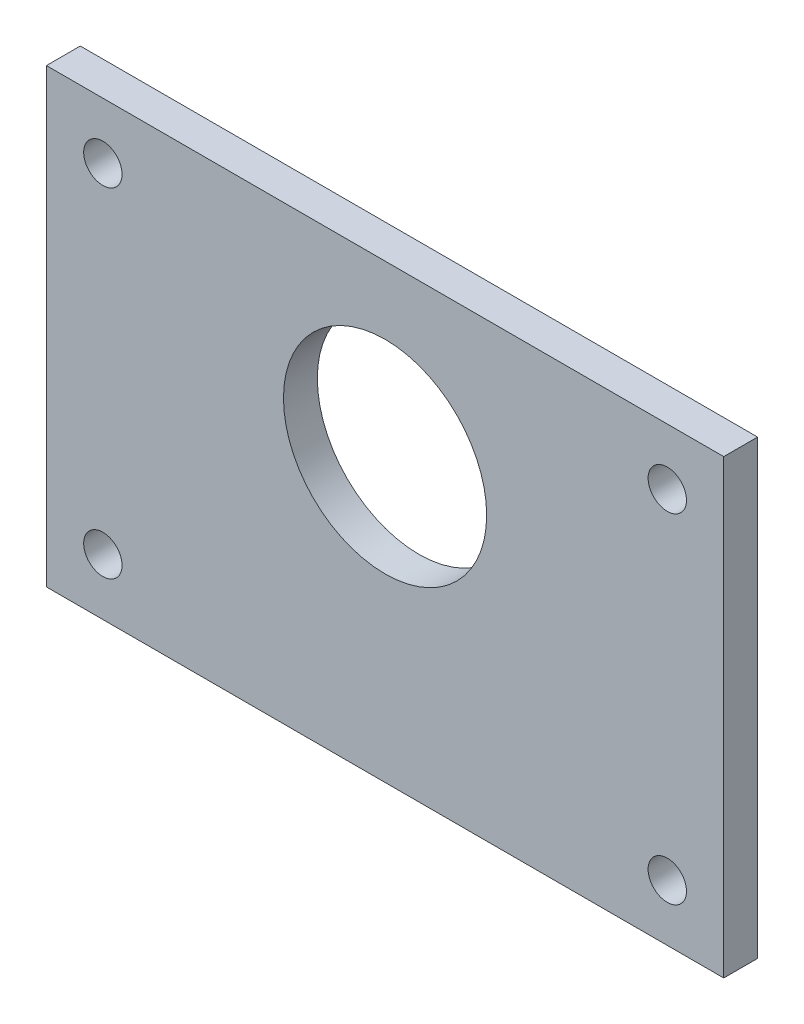
ISO-10303-21;
HEADER;
FILE_DESCRIPTION(('STEP AP214'),'2;1');
FILE_NAME('part.step','',(''),(''),'','','');
FILE_SCHEMA(('AUTOMOTIVE_DESIGN { 1 0 10303 214 1 1 1 1 }'));
ENDSEC;
DATA;
#1=APPLICATION_CONTEXT('core data for automotive mechanical design processes');
#2=APPLICATION_PROTOCOL_DEFINITION('international standard','automotive_design',2000,#1);
#3=PRODUCT_CONTEXT('',#1,'mechanical');
#4=PRODUCT('Part','Part','',(#3));
#5=PRODUCT_RELATED_PRODUCT_CATEGORY('part','',(#4));
#6=PRODUCT_DEFINITION_FORMATION('','',#4);
#7=PRODUCT_DEFINITION_CONTEXT('part definition',#1,'design');
#8=PRODUCT_DEFINITION('design','',#6,#7);
#9=PRODUCT_DEFINITION_SHAPE('','',#8);
#10=(LENGTH_UNIT() NAMED_UNIT(*) SI_UNIT(.MILLI.,.METRE.));
#11=(NAMED_UNIT(*) PLANE_ANGLE_UNIT() SI_UNIT($,.RADIAN.));
#12=(NAMED_UNIT(*) SI_UNIT($,.STERADIAN.) SOLID_ANGLE_UNIT());
#13=UNCERTAINTY_MEASURE_WITH_UNIT(LENGTH_MEASURE(1.E-05),#10,'distance_accuracy_value','');
#14=(GEOMETRIC_REPRESENTATION_CONTEXT(3) GLOBAL_UNCERTAINTY_ASSIGNED_CONTEXT((#13)) GLOBAL_UNIT_ASSIGNED_CONTEXT((#10,
#11,#12)) REPRESENTATION_CONTEXT('',''));
#15=CARTESIAN_POINT('',(0.,0.,0.));
#16=DIRECTION('',(0.,0.,1.));
#17=DIRECTION('',(1.,0.,0.));
#18=AXIS2_PLACEMENT_3D('',#15,#16,#17);
#19=CARTESIAN_POINT('',(0.,0.,0.00630000000001));
#20=DIRECTION('',(0.,0.,1.));
#21=DIRECTION('',(1.,0.,0.));
#22=AXIS2_PLACEMENT_3D('',#19,#20,#21);
#23=PLANE('',#22);
#24=CARTESIAN_POINT('',(55.,35.,0.00630000000001));
#25=DIRECTION('',(0.,0.,1.));
#26=DIRECTION('',(1.,0.,0.));
#27=AXIS2_PLACEMENT_3D('',#24,#25,#26);
#28=CIRCLE('',#27,1.7);
#29=CARTESIAN_POINT('',(56.7,35.,0.00630000000001));
#30=VERTEX_POINT('',#29);
#31=EDGE_CURVE('E93',#30,#30,#28,.T.);
#32=ORIENTED_EDGE('',*,*,#31,.T.);
#33=EDGE_LOOP('',(#32));
#34=FACE_BOUND('',#33,.T.);
#35=CARTESIAN_POINT('',(5.,35.,0.00630000000001));
#36=DIRECTION('',(0.,0.,1.));
#37=DIRECTION('',(1.,0.,0.));
#38=AXIS2_PLACEMENT_3D('',#35,#36,#37);
#39=CIRCLE('',#38,1.7);
#40=CARTESIAN_POINT('',(6.7,35.,0.00630000000001));
#41=VERTEX_POINT('',#40);
#42=EDGE_CURVE('E97',#41,#41,#39,.T.);
#43=ORIENTED_EDGE('',*,*,#42,.T.);
#44=EDGE_LOOP('',(#43));
#45=FACE_BOUND('',#44,.T.);
#46=CARTESIAN_POINT('',(30.,25.,0.00630000000001));
#47=DIRECTION('',(0.,0.,1.));
#48=DIRECTION('',(1.,0.,0.));
#49=AXIS2_PLACEMENT_3D('',#46,#47,#48);
#50=CIRCLE('',#49,9.);
#51=CARTESIAN_POINT('',(39.,25.,0.00630000000001));
#52=VERTEX_POINT('',#51);
#53=EDGE_CURVE('E100',#52,#52,#50,.T.);
#54=ORIENTED_EDGE('',*,*,#53,.T.);
#55=EDGE_LOOP('',(#54));
#56=FACE_BOUND('',#55,.T.);
#57=CARTESIAN_POINT('',(55.,5.,0.00630000000001));
#58=DIRECTION('',(0.,0.,1.));
#59=DIRECTION('',(1.,0.,0.));
#60=AXIS2_PLACEMENT_3D('',#57,#58,#59);
#61=CIRCLE('',#60,1.7);
#62=CARTESIAN_POINT('',(56.7,5.,0.00630000000001));
#63=VERTEX_POINT('',#62);
#64=EDGE_CURVE('E102',#63,#63,#61,.T.);
#65=ORIENTED_EDGE('',*,*,#64,.T.);
#66=EDGE_LOOP('',(#65));
#67=FACE_BOUND('',#66,.T.);
#68=CARTESIAN_POINT('',(5.,5.,0.00630000000001));
#69=DIRECTION('',(0.,0.,1.));
#70=DIRECTION('',(1.,0.,0.));
#71=AXIS2_PLACEMENT_3D('',#68,#69,#70);
#72=CIRCLE('',#71,1.7);
#73=CARTESIAN_POINT('',(6.7,5.,0.00630000000001));
#74=VERTEX_POINT('',#73);
#75=EDGE_CURVE('E19',#74,#74,#72,.T.);
#76=ORIENTED_EDGE('',*,*,#75,.T.);
#77=EDGE_LOOP('',(#76));
#78=FACE_BOUND('',#77,.T.);
#79=DIRECTION('',(0.,1.,0.));
#80=VECTOR('',#79,1.);
#81=CARTESIAN_POINT('',(60.,0.,0.00630000000001));
#82=LINE('',#81,#80);
#83=CARTESIAN_POINT('',(60.,0.,0.00630000000001));
#84=VERTEX_POINT('',#83);
#85=CARTESIAN_POINT('',(60.,40.,0.00630000000001));
#86=VERTEX_POINT('',#85);
#87=EDGE_CURVE('E61',#84,#86,#82,.T.);
#88=ORIENTED_EDGE('',*,*,#87,.F.);
#89=DIRECTION('',(1.,0.,0.));
#90=VECTOR('',#89,1.);
#91=CARTESIAN_POINT('',(0.,0.,0.00630000000001));
#92=LINE('',#91,#90);
#93=CARTESIAN_POINT('',(0.,0.,0.00630000000001));
#94=VERTEX_POINT('',#93);
#95=EDGE_CURVE('E55',#84,#94,#92,.F.);
#96=ORIENTED_EDGE('',*,*,#95,.T.);
#97=DIRECTION('',(0.,1.,0.));
#98=VECTOR('',#97,1.);
#99=CARTESIAN_POINT('',(0.,0.,0.00630000000001));
#100=LINE('',#99,#98);
#101=CARTESIAN_POINT('',(0.,40.,0.00630000000001));
#102=VERTEX_POINT('',#101);
#103=EDGE_CURVE('E59',#94,#102,#100,.T.);
#104=ORIENTED_EDGE('',*,*,#103,.T.);
#105=DIRECTION('',(1.,0.,0.));
#106=VECTOR('',#105,1.);
#107=CARTESIAN_POINT('',(0.,40.,0.00630000000001));
#108=LINE('',#107,#106);
#109=EDGE_CURVE('E111',#86,#102,#108,.F.);
#110=ORIENTED_EDGE('',*,*,#109,.F.);
#111=EDGE_LOOP('',(#88,#96,#104,#110));
#112=FACE_BOUND('',#111,.T.);
#113=ADVANCED_FACE('F16',(#34,#45,#56,#67,#78,#112),#23,.F.);
#114=CARTESIAN_POINT('',(0.,0.,0.00630000000001));
#115=DIRECTION('',(1.,0.,0.));
#116=DIRECTION('',(0.,0.,-1.));
#117=AXIS2_PLACEMENT_3D('',#114,#115,#116);
#118=PLANE('',#117);
#119=DIRECTION('',(0.,0.,1.));
#120=VECTOR('',#119,1.);
#121=CARTESIAN_POINT('',(0.,40.,0.00630000000001));
#122=LINE('',#121,#120);
#123=CARTESIAN_POINT('',(0.,40.,3.0063));
#124=VERTEX_POINT('',#123);
#125=EDGE_CURVE('E69',#102,#124,#122,.T.);
#126=ORIENTED_EDGE('',*,*,#125,.F.);
#127=ORIENTED_EDGE('',*,*,#103,.F.);
#128=DIRECTION('',(0.,0.,1.));
#129=VECTOR('',#128,1.);
#130=CARTESIAN_POINT('',(0.,0.,0.00630000000001));
#131=LINE('',#130,#129);
#132=CARTESIAN_POINT('',(0.,0.,3.0063));
#133=VERTEX_POINT('',#132);
#134=EDGE_CURVE('E63',#94,#133,#131,.T.);
#135=ORIENTED_EDGE('',*,*,#134,.T.);
#136=DIRECTION('',(0.,1.,0.));
#137=VECTOR('',#136,1.);
#138=CARTESIAN_POINT('',(0.,0.,3.0063));
#139=LINE('',#138,#137);
#140=EDGE_CURVE('E96',#124,#133,#139,.F.);
#141=ORIENTED_EDGE('',*,*,#140,.F.);
#142=EDGE_LOOP('',(#126,#127,#135,#141));
#143=FACE_BOUND('',#142,.T.);
#144=ADVANCED_FACE('F66',(#143),#118,.F.);
#145=CARTESIAN_POINT('',(0.,0.,0.00630000000001));
#146=DIRECTION('',(0.,1.,0.));
#147=DIRECTION('',(0.,0.,1.));
#148=AXIS2_PLACEMENT_3D('',#145,#146,#147);
#149=PLANE('',#148);
#150=DIRECTION('',(1.,0.,0.));
#151=VECTOR('',#150,1.);
#152=CARTESIAN_POINT('',(0.,0.,3.0063));
#153=LINE('',#152,#151);
#154=CARTESIAN_POINT('',(60.,0.,3.0063));
#155=VERTEX_POINT('',#154);
#156=EDGE_CURVE('E74',#133,#155,#153,.T.);
#157=ORIENTED_EDGE('',*,*,#156,.F.);
#158=ORIENTED_EDGE('',*,*,#134,.F.);
#159=ORIENTED_EDGE('',*,*,#95,.F.);
#160=DIRECTION('',(0.,0.,-1.));
#161=VECTOR('',#160,1.);
#162=CARTESIAN_POINT('',(60.,0.,0.00630000000001));
#163=LINE('',#162,#161);
#164=EDGE_CURVE('E76',#155,#84,#163,.T.);
#165=ORIENTED_EDGE('',*,*,#164,.F.);
#166=EDGE_LOOP('',(#157,#158,#159,#165));
#167=FACE_BOUND('',#166,.T.);
#168=ADVANCED_FACE('F72',(#167),#149,.F.);
#169=CARTESIAN_POINT('',(60.,0.,0.00630000000001));
#170=DIRECTION('',(1.,0.,0.));
#171=DIRECTION('',(0.,0.,-1.));
#172=AXIS2_PLACEMENT_3D('',#169,#170,#171);
#173=PLANE('',#172);
#174=DIRECTION('',(0.,0.,1.));
#175=VECTOR('',#174,1.);
#176=CARTESIAN_POINT('',(60.,40.,0.00630000000001));
#177=LINE('',#176,#175);
#178=CARTESIAN_POINT('',(60.,40.,3.0063));
#179=VERTEX_POINT('',#178);
#180=EDGE_CURVE('E34',#179,#86,#177,.F.);
#181=ORIENTED_EDGE('',*,*,#180,.F.);
#182=DIRECTION('',(0.,1.,0.));
#183=VECTOR('',#182,1.);
#184=CARTESIAN_POINT('',(60.,0.,3.0063));
#185=LINE('',#184,#183);
#186=EDGE_CURVE('E118',#155,#179,#185,.T.);
#187=ORIENTED_EDGE('',*,*,#186,.F.);
#188=ORIENTED_EDGE('',*,*,#164,.T.);
#189=ORIENTED_EDGE('',*,*,#87,.T.);
#190=EDGE_LOOP('',(#181,#187,#188,#189));
#191=FACE_BOUND('',#190,.T.);
#192=ADVANCED_FACE('F116',(#191),#173,.T.);
#193=CARTESIAN_POINT('',(0.,40.,0.00630000000001));
#194=DIRECTION('',(0.,1.,0.));
#195=DIRECTION('',(0.,0.,1.));
#196=AXIS2_PLACEMENT_3D('',#193,#194,#195);
#197=PLANE('',#196);
#198=DIRECTION('',(1.,0.,0.));
#199=VECTOR('',#198,1.);
#200=CARTESIAN_POINT('',(0.,40.,3.0063));
#201=LINE('',#200,#199);
#202=EDGE_CURVE('E92',#179,#124,#201,.F.);
#203=ORIENTED_EDGE('',*,*,#202,.F.);
#204=ORIENTED_EDGE('',*,*,#180,.T.);
#205=ORIENTED_EDGE('',*,*,#109,.T.);
#206=ORIENTED_EDGE('',*,*,#125,.T.);
#207=EDGE_LOOP('',(#203,#204,#205,#206));
#208=FACE_BOUND('',#207,.T.);
#209=ADVANCED_FACE('F124',(#208),#197,.T.);
#210=CARTESIAN_POINT('',(5.,5.,0.00630000000001));
#211=DIRECTION('',(0.,0.,1.));
#212=DIRECTION('',(1.,0.,0.));
#213=AXIS2_PLACEMENT_3D('',#210,#211,#212);
#214=CYLINDRICAL_SURFACE('',#213,1.7);
#215=ORIENTED_EDGE('',*,*,#75,.F.);
#216=EDGE_LOOP('',(#215));
#217=FACE_BOUND('',#216,.T.);
#218=CARTESIAN_POINT('',(5.,5.,3.0063));
#219=DIRECTION('',(0.,0.,1.));
#220=DIRECTION('',(1.,0.,0.));
#221=AXIS2_PLACEMENT_3D('',#218,#219,#220);
#222=CIRCLE('',#221,1.7);
#223=CARTESIAN_POINT('',(6.7,5.,3.0063));
#224=VERTEX_POINT('',#223);
#225=EDGE_CURVE('E89',#224,#224,#222,.F.);
#226=ORIENTED_EDGE('',*,*,#225,.F.);
#227=EDGE_LOOP('',(#226));
#228=FACE_BOUND('',#227,.T.);
#229=ADVANCED_FACE('F126',(#217,#228),#214,.F.);
#230=CARTESIAN_POINT('',(55.,5.,0.00630000000001));
#231=DIRECTION('',(0.,0.,1.));
#232=DIRECTION('',(1.,0.,0.));
#233=AXIS2_PLACEMENT_3D('',#230,#231,#232);
#234=CYLINDRICAL_SURFACE('',#233,1.7);
#235=ORIENTED_EDGE('',*,*,#64,.F.);
#236=EDGE_LOOP('',(#235));
#237=FACE_BOUND('',#236,.T.);
#238=CARTESIAN_POINT('',(55.,5.,3.0063));
#239=DIRECTION('',(0.,0.,1.));
#240=DIRECTION('',(1.,0.,0.));
#241=AXIS2_PLACEMENT_3D('',#238,#239,#240);
#242=CIRCLE('',#241,1.7);
#243=CARTESIAN_POINT('',(56.7,5.,3.0063));
#244=VERTEX_POINT('',#243);
#245=EDGE_CURVE('E86',#244,#244,#242,.F.);
#246=ORIENTED_EDGE('',*,*,#245,.F.);
#247=EDGE_LOOP('',(#246));
#248=FACE_BOUND('',#247,.T.);
#249=ADVANCED_FACE('F133',(#237,#248),#234,.F.);
#250=CARTESIAN_POINT('',(30.,25.,0.00630000000001));
#251=DIRECTION('',(0.,0.,1.));
#252=DIRECTION('',(1.,0.,0.));
#253=AXIS2_PLACEMENT_3D('',#250,#251,#252);
#254=CYLINDRICAL_SURFACE('',#253,9.);
#255=ORIENTED_EDGE('',*,*,#53,.F.);
#256=EDGE_LOOP('',(#255));
#257=FACE_BOUND('',#256,.T.);
#258=CARTESIAN_POINT('',(30.,25.,3.0063));
#259=DIRECTION('',(0.,0.,1.));
#260=DIRECTION('',(1.,0.,0.));
#261=AXIS2_PLACEMENT_3D('',#258,#259,#260);
#262=CIRCLE('',#261,9.);
#263=CARTESIAN_POINT('',(39.,25.,3.0063));
#264=VERTEX_POINT('',#263);
#265=EDGE_CURVE('E83',#264,#264,#262,.F.);
#266=ORIENTED_EDGE('',*,*,#265,.F.);
#267=EDGE_LOOP('',(#266));
#268=FACE_BOUND('',#267,.T.);
#269=ADVANCED_FACE('F151',(#257,#268),#254,.F.);
#270=CARTESIAN_POINT('',(5.,35.,0.00630000000001));
#271=DIRECTION('',(0.,0.,1.));
#272=DIRECTION('',(1.,0.,0.));
#273=AXIS2_PLACEMENT_3D('',#270,#271,#272);
#274=CYLINDRICAL_SURFACE('',#273,1.7);
#275=ORIENTED_EDGE('',*,*,#42,.F.);
#276=EDGE_LOOP('',(#275));
#277=FACE_BOUND('',#276,.T.);
#278=CARTESIAN_POINT('',(5.,35.,3.0063));
#279=DIRECTION('',(0.,0.,1.));
#280=DIRECTION('',(1.,0.,0.));
#281=AXIS2_PLACEMENT_3D('',#278,#279,#280);
#282=CIRCLE('',#281,1.7);
#283=CARTESIAN_POINT('',(6.7,35.,3.0063));
#284=VERTEX_POINT('',#283);
#285=EDGE_CURVE('E25',#284,#284,#282,.F.);
#286=ORIENTED_EDGE('',*,*,#285,.F.);
#287=EDGE_LOOP('',(#286));
#288=FACE_BOUND('',#287,.T.);
#289=ADVANCED_FACE('F144',(#277,#288),#274,.F.);
#290=CARTESIAN_POINT('',(55.,35.,0.00630000000001));
#291=DIRECTION('',(0.,0.,1.));
#292=DIRECTION('',(1.,0.,0.));
#293=AXIS2_PLACEMENT_3D('',#290,#291,#292);
#294=CYLINDRICAL_SURFACE('',#293,1.7);
#295=ORIENTED_EDGE('',*,*,#31,.F.);
#296=EDGE_LOOP('',(#295));
#297=FACE_BOUND('',#296,.T.);
#298=CARTESIAN_POINT('',(55.,35.,3.0063));
#299=DIRECTION('',(0.,0.,1.));
#300=DIRECTION('',(1.,0.,0.));
#301=AXIS2_PLACEMENT_3D('',#298,#299,#300);
#302=CIRCLE('',#301,1.7);
#303=CARTESIAN_POINT('',(56.7,35.,3.0063));
#304=VERTEX_POINT('',#303);
#305=EDGE_CURVE('E11',#304,#304,#302,.F.);
#306=ORIENTED_EDGE('',*,*,#305,.F.);
#307=EDGE_LOOP('',(#306));
#308=FACE_BOUND('',#307,.T.);
#309=ADVANCED_FACE('F138',(#297,#308),#294,.F.);
#310=CARTESIAN_POINT('',(0.,0.,3.0063));
#311=DIRECTION('',(0.,0.,1.));
#312=DIRECTION('',(1.,0.,0.));
#313=AXIS2_PLACEMENT_3D('',#310,#311,#312);
#314=PLANE('',#313);
#315=ORIENTED_EDGE('',*,*,#305,.T.);
#316=EDGE_LOOP('',(#315));
#317=FACE_BOUND('',#316,.T.);
#318=ORIENTED_EDGE('',*,*,#285,.T.);
#319=EDGE_LOOP('',(#318));
#320=FACE_BOUND('',#319,.T.);
#321=ORIENTED_EDGE('',*,*,#265,.T.);
#322=EDGE_LOOP('',(#321));
#323=FACE_BOUND('',#322,.T.);
#324=ORIENTED_EDGE('',*,*,#245,.T.);
#325=EDGE_LOOP('',(#324));
#326=FACE_BOUND('',#325,.T.);
#327=ORIENTED_EDGE('',*,*,#225,.T.);
#328=EDGE_LOOP('',(#327));
#329=FACE_BOUND('',#328,.T.);
#330=ORIENTED_EDGE('',*,*,#186,.T.);
#331=ORIENTED_EDGE('',*,*,#202,.T.);
#332=ORIENTED_EDGE('',*,*,#140,.T.);
#333=ORIENTED_EDGE('',*,*,#156,.T.);
#334=EDGE_LOOP('',(#330,#331,#332,#333));
#335=FACE_BOUND('',#334,.T.);
#336=ADVANCED_FACE('F122',(#317,#320,#323,#326,#329,#335),#314,.T.);
#337=CLOSED_SHELL('',(#113,#144,#168,#192,#209,#229,#249,#269,#289,#309,#336));
#338=MANIFOLD_SOLID_BREP('B1',#337);
#339=ADVANCED_BREP_SHAPE_REPRESENTATION('',(#18,#338),#14);
#340=SHAPE_DEFINITION_REPRESENTATION(#9,#339);
ENDSEC;
END-ISO-10303-21;
